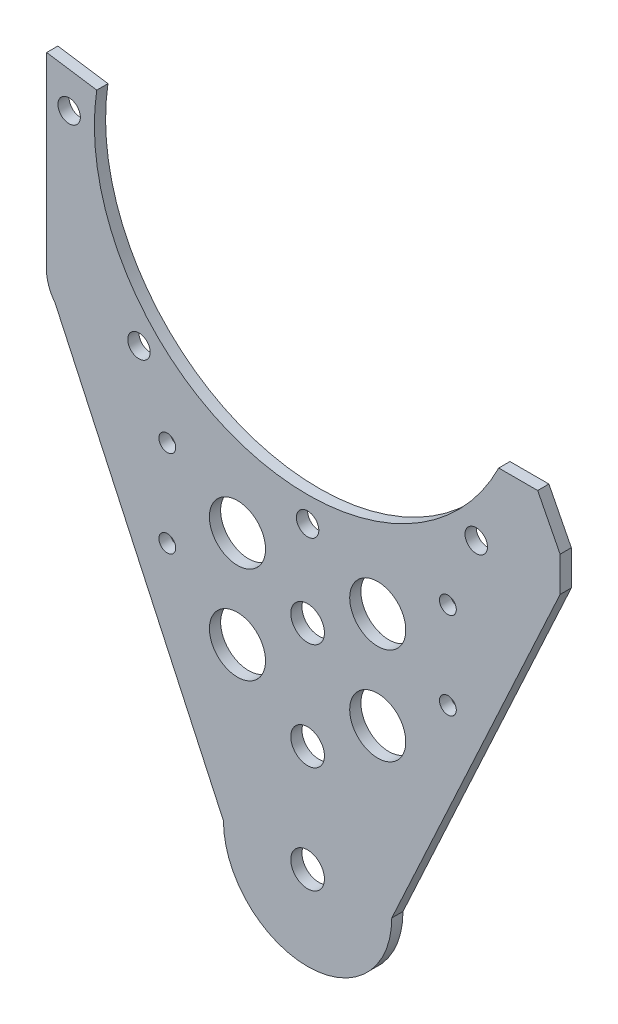
ISO-10303-21;
HEADER;
FILE_DESCRIPTION(('STEP AP214'),'2;1');
FILE_NAME('part.step','',(''),(''),'','','');
FILE_SCHEMA(('AUTOMOTIVE_DESIGN { 1 0 10303 214 1 1 1 1 }'));
ENDSEC;
DATA;
#1=APPLICATION_CONTEXT('core data for automotive mechanical design processes');
#2=APPLICATION_PROTOCOL_DEFINITION('international standard','automotive_design',2000,#1);
#3=PRODUCT_CONTEXT('',#1,'mechanical');
#4=PRODUCT('Part','Part','',(#3));
#5=PRODUCT_RELATED_PRODUCT_CATEGORY('part','',(#4));
#6=PRODUCT_DEFINITION_FORMATION('','',#4);
#7=PRODUCT_DEFINITION_CONTEXT('part definition',#1,'design');
#8=PRODUCT_DEFINITION('design','',#6,#7);
#9=PRODUCT_DEFINITION_SHAPE('','',#8);
#10=(LENGTH_UNIT() NAMED_UNIT(*) SI_UNIT(.MILLI.,.METRE.));
#11=(NAMED_UNIT(*) PLANE_ANGLE_UNIT() SI_UNIT($,.RADIAN.));
#12=(NAMED_UNIT(*) SI_UNIT($,.STERADIAN.) SOLID_ANGLE_UNIT());
#13=UNCERTAINTY_MEASURE_WITH_UNIT(LENGTH_MEASURE(1.E-05),#10,'distance_accuracy_value','');
#14=(GEOMETRIC_REPRESENTATION_CONTEXT(3) GLOBAL_UNCERTAINTY_ASSIGNED_CONTEXT((#13)) GLOBAL_UNIT_ASSIGNED_CONTEXT((#10,
#11,#12)) REPRESENTATION_CONTEXT('',''));
#15=CARTESIAN_POINT('',(0.,0.,0.));
#16=DIRECTION('',(0.,0.,1.));
#17=DIRECTION('',(1.,0.,0.));
#18=AXIS2_PLACEMENT_3D('',#15,#16,#17);
#19=CARTESIAN_POINT('',(0.,56.,2.));
#20=DIRECTION('',(0.,0.,1.));
#21=DIRECTION('',(1.,0.,0.));
#22=AXIS2_PLACEMENT_3D('',#19,#20,#21);
#23=PLANE('',#22);
#24=CARTESIAN_POINT('',(12.4999999999993,-11.4051083426373,2.));
#25=DIRECTION('',(0.,0.,1.));
#26=DIRECTION('',(-1.,0.,0.));
#27=AXIS2_PLACEMENT_3D('',#24,#25,#26);
#28=CIRCLE('',#27,5.00000000000163);
#29=CARTESIAN_POINT('',(7.49999999999769,-11.4051083426373,2.));
#30=VERTEX_POINT('',#29);
#31=EDGE_CURVE('E483',#30,#30,#28,.T.);
#32=ORIENTED_EDGE('',*,*,#31,.F.);
#33=EDGE_LOOP('',(#32));
#34=FACE_BOUND('',#33,.T.);
#35=CARTESIAN_POINT('',(-42.5,56.0000000000001,2.));
#36=DIRECTION('',(0.,0.,1.));
#37=DIRECTION('',(1.,0.,0.));
#38=AXIS2_PLACEMENT_3D('',#35,#36,#37);
#39=CIRCLE('',#38,2.);
#40=CARTESIAN_POINT('',(-40.5,56.0000000000001,2.));
#41=VERTEX_POINT('',#40);
#42=EDGE_CURVE('E495',#41,#41,#39,.T.);
#43=ORIENTED_EDGE('',*,*,#42,.F.);
#44=EDGE_LOOP('',(#43));
#45=FACE_BOUND('',#44,.T.);
#46=CARTESIAN_POINT('',(-12.4999999999987,-11.4051083426374,2.));
#47=DIRECTION('',(0.,0.,1.));
#48=DIRECTION('',(1.,0.,0.));
#49=AXIS2_PLACEMENT_3D('',#46,#47,#48);
#50=CIRCLE('',#49,5.00000000000164);
#51=CARTESIAN_POINT('',(-7.49999999999706,-11.4051083426374,2.));
#52=VERTEX_POINT('',#51);
#53=EDGE_CURVE('E507',#52,#52,#50,.T.);
#54=ORIENTED_EDGE('',*,*,#53,.F.);
#55=EDGE_LOOP('',(#54));
#56=FACE_BOUND('',#55,.T.);
#57=CARTESIAN_POINT('',(-30.0520382004283,25.9479617995718,2.));
#58=DIRECTION('',(0.,0.,1.));
#59=DIRECTION('',(1.,0.,0.));
#60=AXIS2_PLACEMENT_3D('',#57,#58,#59);
#61=CIRCLE('',#60,2.);
#62=CARTESIAN_POINT('',(-28.0520382004283,25.9479617995718,2.));
#63=VERTEX_POINT('',#62);
#64=EDGE_CURVE('E519',#63,#63,#61,.T.);
#65=ORIENTED_EDGE('',*,*,#64,.F.);
#66=EDGE_LOOP('',(#65));
#67=FACE_BOUND('',#66,.T.);
#68=CARTESIAN_POINT('',(24.9999999999965,13.509783314725,2.));
#69=DIRECTION('',(0.,0.,1.));
#70=DIRECTION('',(-1.,0.,0.));
#71=AXIS2_PLACEMENT_3D('',#68,#69,#70);
#72=CIRCLE('',#71,1.50000000000253);
#73=CARTESIAN_POINT('',(23.499999999994,13.509783314725,2.));
#74=VERTEX_POINT('',#73);
#75=EDGE_CURVE('E531',#74,#74,#72,.T.);
#76=ORIENTED_EDGE('',*,*,#75,.F.);
#77=EDGE_LOOP('',(#76));
#78=FACE_BOUND('',#77,.T.);
#79=CARTESIAN_POINT('',(1.65498506012817E-13,-1.82000000000001,2.));
#80=DIRECTION('',(0.,0.,1.));
#81=DIRECTION('',(1.,0.,0.));
#82=AXIS2_PLACEMENT_3D('',#79,#80,#81);
#83=CIRCLE('',#82,2.99999999999987);
#84=CARTESIAN_POINT('',(3.00000000000004,-1.82000000000001,2.));
#85=VERTEX_POINT('',#84);
#86=EDGE_CURVE('E543',#85,#85,#83,.T.);
#87=ORIENTED_EDGE('',*,*,#86,.F.);
#88=EDGE_LOOP('',(#87));
#89=FACE_BOUND('',#88,.T.);
#90=CARTESIAN_POINT('',(-1.23647570002783E-12,-20.82,2.));
#91=DIRECTION('',(0.,0.,1.));
#92=DIRECTION('',(1.,0.,0.));
#93=AXIS2_PLACEMENT_3D('',#90,#91,#92);
#94=CIRCLE('',#93,2.99999999999841);
#95=CARTESIAN_POINT('',(2.99999999999718,-20.82,2.));
#96=VERTEX_POINT('',#95);
#97=EDGE_CURVE('E555',#96,#96,#94,.T.);
#98=ORIENTED_EDGE('',*,*,#97,.F.);
#99=EDGE_LOOP('',(#98));
#100=FACE_BOUND('',#99,.T.);
#101=DIRECTION('',(0.,1.,0.));
#102=VECTOR('',#101,1.);
#103=CARTESIAN_POINT('',(44.9999999999948,25.1097833147259,2.));
#104=LINE('',#103,#102);
#105=CARTESIAN_POINT('',(44.9999999999948,25.1097833147259,2.));
#106=VERTEX_POINT('',#105);
#107=CARTESIAN_POINT('',(44.9999999999946,31.3170511820597,2.));
#108=VERTEX_POINT('',#107);
#109=EDGE_CURVE('E166',#106,#108,#104,.T.);
#110=ORIENTED_EDGE('',*,*,#109,.T.);
#111=DIRECTION('',(-0.454677876394381,0.890655954180679,0.));
#112=VECTOR('',#111,1.);
#113=CARTESIAN_POINT('',(44.9999999999946,31.3170511820597,2.));
#114=LINE('',#113,#112);
#115=CARTESIAN_POINT('',(40.9999999999945,39.1525408807769,2.));
#116=VERTEX_POINT('',#115);
#117=EDGE_CURVE('E99',#108,#116,#114,.T.);
#118=ORIENTED_EDGE('',*,*,#117,.T.);
#119=DIRECTION('',(-1.,0.,0.));
#120=VECTOR('',#119,1.);
#121=CARTESIAN_POINT('',(34.061167349727,39.1525408807769,2.));
#122=LINE('',#121,#120);
#123=CARTESIAN_POINT('',(34.061167349727,39.1525408807769,2.));
#124=VERTEX_POINT('',#123);
#125=EDGE_CURVE('E187',#116,#124,#122,.T.);
#126=ORIENTED_EDGE('',*,*,#125,.T.);
#127=CARTESIAN_POINT('',(0.,56.,2.));
#128=DIRECTION('',(0.,0.,-1.));
#129=DIRECTION('',(1.,0.,0.));
#130=AXIS2_PLACEMENT_3D('',#127,#128,#129);
#131=CIRCLE('',#130,38.);
#132=CARTESIAN_POINT('',(-37.5766125260326,61.6566943587582,2.));
#133=VERTEX_POINT('',#132);
#134=EDGE_CURVE('E206',#124,#133,#131,.T.);
#135=ORIENTED_EDGE('',*,*,#134,.T.);
#136=DIRECTION('',(-0.98885822436928,0.148860377862059,0.));
#137=VECTOR('',#136,1.);
#138=CARTESIAN_POINT('',(-46.4999999999946,63.,2.));
#139=LINE('',#138,#137);
#140=CARTESIAN_POINT('',(-46.4999999999946,63.,2.));
#141=VERTEX_POINT('',#140);
#142=EDGE_CURVE('E203',#133,#141,#139,.T.);
#143=ORIENTED_EDGE('',*,*,#142,.T.);
#144=DIRECTION('',(0.,-1.,0.));
#145=VECTOR('',#144,1.);
#146=CARTESIAN_POINT('',(-46.4999999999946,63.,2.));
#147=LINE('',#146,#145);
#148=CARTESIAN_POINT('',(-46.4999999999946,28.7734947561586,2.));
#149=VERTEX_POINT('',#148);
#150=EDGE_CURVE('E205',#141,#149,#147,.T.);
#151=ORIENTED_EDGE('',*,*,#150,.T.);
#152=CARTESIAN_POINT('',(-46.4999999999946,28.7734947561586,2.));
#153=CARTESIAN_POINT('',(-46.2742405415082,26.7251207672892,2.));
#154=CARTESIAN_POINT('',(-44.9999999999945,25.1097833147254,2.));
#155=B_SPLINE_CURVE_WITH_KNOTS('',2,(#152,#153,#154),.UNSPECIFIED.,.F.,.F.,(3,3),(0.,1.),.UNSPECIFIED.);
#156=CARTESIAN_POINT('',(-44.9999999999945,25.1097833147254,2.));
#157=VERTEX_POINT('',#156);
#158=EDGE_CURVE('E124',#149,#157,#155,.T.);
#159=ORIENTED_EDGE('',*,*,#158,.T.);
#160=DIRECTION('',(0.419431668165056,-0.907786910976512,0.));
#161=VECTOR('',#160,1.);
#162=CARTESIAN_POINT('',(-44.9999999999945,25.1097833147254,2.));
#163=LINE('',#162,#161);
#164=CARTESIAN_POINT('',(-14.9999999999996,-39.82,2.));
#165=VERTEX_POINT('',#164);
#166=EDGE_CURVE('E118',#157,#165,#163,.T.);
#167=ORIENTED_EDGE('',*,*,#166,.T.);
#168=CARTESIAN_POINT('',(3.50073083856771E-13,-39.82,2.));
#169=DIRECTION('',(0.,0.,1.));
#170=DIRECTION('',(1.,0.,0.));
#171=AXIS2_PLACEMENT_3D('',#168,#169,#170);
#172=CIRCLE('',#171,15.);
#173=CARTESIAN_POINT('',(15.0000000000006,-39.82,2.));
#174=VERTEX_POINT('',#173);
#175=EDGE_CURVE('E122',#165,#174,#172,.T.);
#176=ORIENTED_EDGE('',*,*,#175,.T.);
#177=DIRECTION('',(0.419431668165044,0.907786910976518,0.));
#178=VECTOR('',#177,1.);
#179=CARTESIAN_POINT('',(44.9999999999948,25.1097833147259,2.));
#180=LINE('',#179,#178);
#181=EDGE_CURVE('E50',#174,#106,#180,.T.);
#182=ORIENTED_EDGE('',*,*,#181,.T.);
#183=EDGE_LOOP('',(#110,#118,#126,#135,#143,#151,#159,#167,#176,#182));
#184=FACE_BOUND('',#183,.T.);
#185=CARTESIAN_POINT('',(-24.9999999999961,-1.99021668527465,2.));
#186=DIRECTION('',(0.,0.,1.));
#187=DIRECTION('',(1.,0.,0.));
#188=AXIS2_PLACEMENT_3D('',#185,#186,#187);
#189=CIRCLE('',#188,1.50000000000158);
#190=CARTESIAN_POINT('',(-23.4999999999945,-1.99021668527465,2.));
#191=VERTEX_POINT('',#190);
#192=EDGE_CURVE('E146',#191,#191,#189,.T.);
#193=ORIENTED_EDGE('',*,*,#192,.F.);
#194=EDGE_LOOP('',(#193));
#195=FACE_BOUND('',#194,.T.);
#196=CARTESIAN_POINT('',(3.50073083856771E-13,-39.82,2.));
#197=DIRECTION('',(0.,0.,1.));
#198=DIRECTION('',(1.,0.,0.));
#199=AXIS2_PLACEMENT_3D('',#196,#197,#198);
#200=CIRCLE('',#199,2.9999999999998);
#201=CARTESIAN_POINT('',(3.00000000000015,-39.82,2.));
#202=VERTEX_POINT('',#201);
#203=EDGE_CURVE('E549',#202,#202,#200,.T.);
#204=ORIENTED_EDGE('',*,*,#203,.F.);
#205=EDGE_LOOP('',(#204));
#206=FACE_BOUND('',#205,.T.);
#207=CARTESIAN_POINT('',(-24.9999999999966,13.5097833147244,2.));
#208=DIRECTION('',(0.,0.,1.));
#209=DIRECTION('',(1.,0.,0.));
#210=AXIS2_PLACEMENT_3D('',#207,#208,#209);
#211=CIRCLE('',#210,1.50000000000305);
#212=CARTESIAN_POINT('',(-23.4999999999935,13.5097833147244,2.));
#213=VERTEX_POINT('',#212);
#214=EDGE_CURVE('E537',#213,#213,#211,.T.);
#215=ORIENTED_EDGE('',*,*,#214,.F.);
#216=EDGE_LOOP('',(#215));
#217=FACE_BOUND('',#216,.T.);
#218=CARTESIAN_POINT('',(0.,13.5,2.));
#219=DIRECTION('',(0.,0.,1.));
#220=DIRECTION('',(1.,0.,0.));
#221=AXIS2_PLACEMENT_3D('',#218,#219,#220);
#222=CIRCLE('',#221,2.);
#223=CARTESIAN_POINT('',(1.99999999999992,13.5,2.));
#224=VERTEX_POINT('',#223);
#225=EDGE_CURVE('E525',#224,#224,#222,.T.);
#226=ORIENTED_EDGE('',*,*,#225,.F.);
#227=EDGE_LOOP('',(#226));
#228=FACE_BOUND('',#227,.T.);
#229=CARTESIAN_POINT('',(24.9999999999967,-1.99021668527441,2.));
#230=DIRECTION('',(0.,0.,1.));
#231=DIRECTION('',(-1.,0.,0.));
#232=AXIS2_PLACEMENT_3D('',#229,#230,#231);
#233=CIRCLE('',#232,1.50000000000165);
#234=CARTESIAN_POINT('',(23.499999999995,-1.99021668527441,2.));
#235=VERTEX_POINT('',#234);
#236=EDGE_CURVE('E513',#235,#235,#233,.T.);
#237=ORIENTED_EDGE('',*,*,#236,.F.);
#238=EDGE_LOOP('',(#237));
#239=FACE_BOUND('',#238,.T.);
#240=CARTESIAN_POINT('',(-12.4999999999981,5.84489165736238,2.));
#241=DIRECTION('',(0.,0.,1.));
#242=DIRECTION('',(1.,0.,0.));
#243=AXIS2_PLACEMENT_3D('',#240,#241,#242);
#244=CIRCLE('',#243,5.00000000000132);
#245=CARTESIAN_POINT('',(-7.49999999999678,5.84489165736238,2.));
#246=VERTEX_POINT('',#245);
#247=EDGE_CURVE('E501',#246,#246,#244,.T.);
#248=ORIENTED_EDGE('',*,*,#247,.F.);
#249=EDGE_LOOP('',(#248));
#250=FACE_BOUND('',#249,.T.);
#251=CARTESIAN_POINT('',(12.4999999999985,5.84489165736232,2.));
#252=DIRECTION('',(0.,0.,1.));
#253=DIRECTION('',(-1.,0.,0.));
#254=AXIS2_PLACEMENT_3D('',#251,#252,#253);
#255=CIRCLE('',#254,5.00000000000126);
#256=CARTESIAN_POINT('',(7.4999999999972,5.84489165736232,2.));
#257=VERTEX_POINT('',#256);
#258=EDGE_CURVE('E489',#257,#257,#255,.T.);
#259=ORIENTED_EDGE('',*,*,#258,.F.);
#260=EDGE_LOOP('',(#259));
#261=FACE_BOUND('',#260,.T.);
#262=CARTESIAN_POINT('',(30.0520382004282,25.9479617995717,2.));
#263=DIRECTION('',(0.,0.,1.));
#264=DIRECTION('',(1.,0.,0.));
#265=AXIS2_PLACEMENT_3D('',#262,#263,#264);
#266=CIRCLE('',#265,2.);
#267=CARTESIAN_POINT('',(32.0520382004282,25.9479617995717,2.));
#268=VERTEX_POINT('',#267);
#269=EDGE_CURVE('E474',#268,#268,#266,.T.);
#270=ORIENTED_EDGE('',*,*,#269,.F.);
#271=EDGE_LOOP('',(#270));
#272=FACE_BOUND('',#271,.T.);
#273=ADVANCED_FACE('F33',(#34,#45,#56,#67,#78,#89,#100,#184,#195,#206,#217,#228,#239,#250,#261,
#272),#23,.T.);
#274=CARTESIAN_POINT('',(0.,56.,0.));
#275=DIRECTION('',(0.,0.,1.));
#276=DIRECTION('',(1.,0.,0.));
#277=AXIS2_PLACEMENT_3D('',#274,#275,#276);
#278=PLANE('',#277);
#279=DIRECTION('',(0.,1.,0.));
#280=VECTOR('',#279,1.);
#281=CARTESIAN_POINT('',(44.9999999999948,25.1097833147259,0.));
#282=LINE('',#281,#280);
#283=CARTESIAN_POINT('',(44.9999999999948,25.1097833147259,0.));
#284=VERTEX_POINT('',#283);
#285=CARTESIAN_POINT('',(44.9999999999946,31.3170511820597,0.));
#286=VERTEX_POINT('',#285);
#287=EDGE_CURVE('E142',#284,#286,#282,.T.);
#288=ORIENTED_EDGE('',*,*,#287,.F.);
#289=DIRECTION('',(0.419431668165044,0.907786910976518,0.));
#290=VECTOR('',#289,1.);
#291=CARTESIAN_POINT('',(44.9999999999948,25.1097833147259,0.));
#292=LINE('',#291,#290);
#293=CARTESIAN_POINT('',(15.0000000000006,-39.82,0.));
#294=VERTEX_POINT('',#293);
#295=EDGE_CURVE('E91',#294,#284,#292,.T.);
#296=ORIENTED_EDGE('',*,*,#295,.F.);
#297=CARTESIAN_POINT('',(3.50073083856771E-13,-39.82,0.));
#298=DIRECTION('',(0.,0.,1.));
#299=DIRECTION('',(1.,0.,0.));
#300=AXIS2_PLACEMENT_3D('',#297,#298,#299);
#301=CIRCLE('',#300,15.);
#302=CARTESIAN_POINT('',(-14.9999999999996,-39.82,0.));
#303=VERTEX_POINT('',#302);
#304=EDGE_CURVE('E85',#303,#294,#301,.T.);
#305=ORIENTED_EDGE('',*,*,#304,.F.);
#306=DIRECTION('',(0.419431668165056,-0.907786910976512,0.));
#307=VECTOR('',#306,1.);
#308=CARTESIAN_POINT('',(-44.9999999999945,25.1097833147254,0.));
#309=LINE('',#308,#307);
#310=CARTESIAN_POINT('',(-44.9999999999945,25.1097833147254,0.));
#311=VERTEX_POINT('',#310);
#312=EDGE_CURVE('E132',#311,#303,#309,.T.);
#313=ORIENTED_EDGE('',*,*,#312,.F.);
#314=CARTESIAN_POINT('',(-46.4999999999946,28.7734947561586,0.));
#315=CARTESIAN_POINT('',(-46.2742405415082,26.7251207672892,0.));
#316=CARTESIAN_POINT('',(-44.9999999999945,25.1097833147254,0.));
#317=B_SPLINE_CURVE_WITH_KNOTS('',2,(#314,#315,#316),.UNSPECIFIED.,.F.,.F.,(3,3),(0.,1.),.UNSPECIFIED.);
#318=CARTESIAN_POINT('',(-46.4999999999946,28.7734947561586,0.));
#319=VERTEX_POINT('',#318);
#320=EDGE_CURVE('E156',#319,#311,#317,.T.);
#321=ORIENTED_EDGE('',*,*,#320,.F.);
#322=DIRECTION('',(0.,-1.,0.));
#323=VECTOR('',#322,1.);
#324=CARTESIAN_POINT('',(-46.4999999999946,63.,0.));
#325=LINE('',#324,#323);
#326=CARTESIAN_POINT('',(-46.4999999999946,63.,0.));
#327=VERTEX_POINT('',#326);
#328=EDGE_CURVE('E154',#327,#319,#325,.T.);
#329=ORIENTED_EDGE('',*,*,#328,.F.);
#330=DIRECTION('',(-0.98885822436928,0.148860377862059,0.));
#331=VECTOR('',#330,1.);
#332=CARTESIAN_POINT('',(-46.4999999999946,63.,0.));
#333=LINE('',#332,#331);
#334=CARTESIAN_POINT('',(-37.5766125260326,61.6566943587582,0.));
#335=VERTEX_POINT('',#334);
#336=EDGE_CURVE('E152',#335,#327,#333,.T.);
#337=ORIENTED_EDGE('',*,*,#336,.F.);
#338=CARTESIAN_POINT('',(0.,56.,0.));
#339=DIRECTION('',(0.,0.,-1.));
#340=DIRECTION('',(1.,0.,0.));
#341=AXIS2_PLACEMENT_3D('',#338,#339,#340);
#342=CIRCLE('',#341,38.);
#343=CARTESIAN_POINT('',(34.061167349727,39.1525408807769,0.));
#344=VERTEX_POINT('',#343);
#345=EDGE_CURVE('E150',#344,#335,#342,.T.);
#346=ORIENTED_EDGE('',*,*,#345,.F.);
#347=DIRECTION('',(-1.,0.,0.));
#348=VECTOR('',#347,1.);
#349=CARTESIAN_POINT('',(34.061167349727,39.1525408807769,0.));
#350=LINE('',#349,#348);
#351=CARTESIAN_POINT('',(40.9999999999945,39.1525408807769,0.));
#352=VERTEX_POINT('',#351);
#353=EDGE_CURVE('E148',#352,#344,#350,.T.);
#354=ORIENTED_EDGE('',*,*,#353,.F.);
#355=DIRECTION('',(-0.454677876394381,0.890655954180679,0.));
#356=VECTOR('',#355,1.);
#357=CARTESIAN_POINT('',(44.9999999999946,31.3170511820597,0.));
#358=LINE('',#357,#356);
#359=EDGE_CURVE('E145',#286,#352,#358,.T.);
#360=ORIENTED_EDGE('',*,*,#359,.F.);
#361=EDGE_LOOP('',(#288,#296,#305,#313,#321,#329,#337,#346,#354,#360));
#362=FACE_BOUND('',#361,.T.);
#363=CARTESIAN_POINT('',(-24.9999999999961,-1.99021668527465,0.));
#364=DIRECTION('',(0.,0.,1.));
#365=DIRECTION('',(1.,0.,0.));
#366=AXIS2_PLACEMENT_3D('',#363,#364,#365);
#367=CIRCLE('',#366,1.50000000000158);
#368=CARTESIAN_POINT('',(-23.4999999999945,-1.99021668527465,0.));
#369=VERTEX_POINT('',#368);
#370=EDGE_CURVE('E558',#369,#369,#367,.T.);
#371=ORIENTED_EDGE('',*,*,#370,.T.);
#372=EDGE_LOOP('',(#371));
#373=FACE_BOUND('',#372,.T.);
#374=CARTESIAN_POINT('',(-1.23647570002783E-12,-20.82,0.));
#375=DIRECTION('',(0.,0.,1.));
#376=DIRECTION('',(1.,0.,0.));
#377=AXIS2_PLACEMENT_3D('',#374,#375,#376);
#378=CIRCLE('',#377,2.99999999999841);
#379=CARTESIAN_POINT('',(2.99999999999718,-20.82,0.));
#380=VERTEX_POINT('',#379);
#381=EDGE_CURVE('E552',#380,#380,#378,.T.);
#382=ORIENTED_EDGE('',*,*,#381,.T.);
#383=EDGE_LOOP('',(#382));
#384=FACE_BOUND('',#383,.T.);
#385=CARTESIAN_POINT('',(3.50073083856771E-13,-39.82,0.));
#386=DIRECTION('',(0.,0.,1.));
#387=DIRECTION('',(1.,0.,0.));
#388=AXIS2_PLACEMENT_3D('',#385,#386,#387);
#389=CIRCLE('',#388,2.9999999999998);
#390=CARTESIAN_POINT('',(3.00000000000015,-39.82,0.));
#391=VERTEX_POINT('',#390);
#392=EDGE_CURVE('E546',#391,#391,#389,.T.);
#393=ORIENTED_EDGE('',*,*,#392,.T.);
#394=EDGE_LOOP('',(#393));
#395=FACE_BOUND('',#394,.T.);
#396=CARTESIAN_POINT('',(1.65498506012817E-13,-1.82000000000001,0.));
#397=DIRECTION('',(0.,0.,1.));
#398=DIRECTION('',(1.,0.,0.));
#399=AXIS2_PLACEMENT_3D('',#396,#397,#398);
#400=CIRCLE('',#399,2.99999999999987);
#401=CARTESIAN_POINT('',(3.00000000000004,-1.82000000000001,0.));
#402=VERTEX_POINT('',#401);
#403=EDGE_CURVE('E540',#402,#402,#400,.T.);
#404=ORIENTED_EDGE('',*,*,#403,.T.);
#405=EDGE_LOOP('',(#404));
#406=FACE_BOUND('',#405,.T.);
#407=CARTESIAN_POINT('',(-24.9999999999966,13.5097833147244,0.));
#408=DIRECTION('',(0.,0.,1.));
#409=DIRECTION('',(1.,0.,0.));
#410=AXIS2_PLACEMENT_3D('',#407,#408,#409);
#411=CIRCLE('',#410,1.50000000000305);
#412=CARTESIAN_POINT('',(-23.4999999999935,13.5097833147244,0.));
#413=VERTEX_POINT('',#412);
#414=EDGE_CURVE('E534',#413,#413,#411,.T.);
#415=ORIENTED_EDGE('',*,*,#414,.T.);
#416=EDGE_LOOP('',(#415));
#417=FACE_BOUND('',#416,.T.);
#418=CARTESIAN_POINT('',(24.9999999999965,13.509783314725,0.));
#419=DIRECTION('',(0.,0.,1.));
#420=DIRECTION('',(-1.,0.,0.));
#421=AXIS2_PLACEMENT_3D('',#418,#419,#420);
#422=CIRCLE('',#421,1.50000000000253);
#423=CARTESIAN_POINT('',(23.499999999994,13.509783314725,0.));
#424=VERTEX_POINT('',#423);
#425=EDGE_CURVE('E528',#424,#424,#422,.T.);
#426=ORIENTED_EDGE('',*,*,#425,.T.);
#427=EDGE_LOOP('',(#426));
#428=FACE_BOUND('',#427,.T.);
#429=CARTESIAN_POINT('',(0.,13.5,0.));
#430=DIRECTION('',(0.,0.,1.));
#431=DIRECTION('',(1.,0.,0.));
#432=AXIS2_PLACEMENT_3D('',#429,#430,#431);
#433=CIRCLE('',#432,2.);
#434=CARTESIAN_POINT('',(1.99999999999992,13.5,0.));
#435=VERTEX_POINT('',#434);
#436=EDGE_CURVE('E522',#435,#435,#433,.T.);
#437=ORIENTED_EDGE('',*,*,#436,.T.);
#438=EDGE_LOOP('',(#437));
#439=FACE_BOUND('',#438,.T.);
#440=CARTESIAN_POINT('',(-30.0520382004283,25.9479617995718,0.));
#441=DIRECTION('',(0.,0.,1.));
#442=DIRECTION('',(1.,0.,0.));
#443=AXIS2_PLACEMENT_3D('',#440,#441,#442);
#444=CIRCLE('',#443,2.);
#445=CARTESIAN_POINT('',(-28.0520382004283,25.9479617995718,0.));
#446=VERTEX_POINT('',#445);
#447=EDGE_CURVE('E516',#446,#446,#444,.T.);
#448=ORIENTED_EDGE('',*,*,#447,.T.);
#449=EDGE_LOOP('',(#448));
#450=FACE_BOUND('',#449,.T.);
#451=CARTESIAN_POINT('',(24.9999999999967,-1.99021668527441,0.));
#452=DIRECTION('',(0.,0.,1.));
#453=DIRECTION('',(-1.,0.,0.));
#454=AXIS2_PLACEMENT_3D('',#451,#452,#453);
#455=CIRCLE('',#454,1.50000000000165);
#456=CARTESIAN_POINT('',(23.499999999995,-1.99021668527441,0.));
#457=VERTEX_POINT('',#456);
#458=EDGE_CURVE('E510',#457,#457,#455,.T.);
#459=ORIENTED_EDGE('',*,*,#458,.T.);
#460=EDGE_LOOP('',(#459));
#461=FACE_BOUND('',#460,.T.);
#462=CARTESIAN_POINT('',(-12.4999999999987,-11.4051083426374,0.));
#463=DIRECTION('',(0.,0.,1.));
#464=DIRECTION('',(1.,0.,0.));
#465=AXIS2_PLACEMENT_3D('',#462,#463,#464);
#466=CIRCLE('',#465,5.00000000000164);
#467=CARTESIAN_POINT('',(-7.49999999999706,-11.4051083426374,0.));
#468=VERTEX_POINT('',#467);
#469=EDGE_CURVE('E504',#468,#468,#466,.T.);
#470=ORIENTED_EDGE('',*,*,#469,.T.);
#471=EDGE_LOOP('',(#470));
#472=FACE_BOUND('',#471,.T.);
#473=CARTESIAN_POINT('',(-12.4999999999981,5.84489165736238,0.));
#474=DIRECTION('',(0.,0.,1.));
#475=DIRECTION('',(1.,0.,0.));
#476=AXIS2_PLACEMENT_3D('',#473,#474,#475);
#477=CIRCLE('',#476,5.00000000000132);
#478=CARTESIAN_POINT('',(-7.49999999999678,5.84489165736238,0.));
#479=VERTEX_POINT('',#478);
#480=EDGE_CURVE('E498',#479,#479,#477,.T.);
#481=ORIENTED_EDGE('',*,*,#480,.T.);
#482=EDGE_LOOP('',(#481));
#483=FACE_BOUND('',#482,.T.);
#484=CARTESIAN_POINT('',(-42.5,56.0000000000001,0.));
#485=DIRECTION('',(0.,0.,1.));
#486=DIRECTION('',(1.,0.,0.));
#487=AXIS2_PLACEMENT_3D('',#484,#485,#486);
#488=CIRCLE('',#487,2.);
#489=CARTESIAN_POINT('',(-40.5,56.0000000000001,0.));
#490=VERTEX_POINT('',#489);
#491=EDGE_CURVE('E492',#490,#490,#488,.T.);
#492=ORIENTED_EDGE('',*,*,#491,.T.);
#493=EDGE_LOOP('',(#492));
#494=FACE_BOUND('',#493,.T.);
#495=CARTESIAN_POINT('',(12.4999999999985,5.84489165736232,0.));
#496=DIRECTION('',(0.,0.,1.));
#497=DIRECTION('',(-1.,0.,0.));
#498=AXIS2_PLACEMENT_3D('',#495,#496,#497);
#499=CIRCLE('',#498,5.00000000000126);
#500=CARTESIAN_POINT('',(7.4999999999972,5.84489165736232,0.));
#501=VERTEX_POINT('',#500);
#502=EDGE_CURVE('E486',#501,#501,#499,.T.);
#503=ORIENTED_EDGE('',*,*,#502,.T.);
#504=EDGE_LOOP('',(#503));
#505=FACE_BOUND('',#504,.T.);
#506=CARTESIAN_POINT('',(12.4999999999993,-11.4051083426373,0.));
#507=DIRECTION('',(0.,0.,1.));
#508=DIRECTION('',(-1.,0.,0.));
#509=AXIS2_PLACEMENT_3D('',#506,#507,#508);
#510=CIRCLE('',#509,5.00000000000163);
#511=CARTESIAN_POINT('',(7.49999999999769,-11.4051083426373,0.));
#512=VERTEX_POINT('',#511);
#513=EDGE_CURVE('E480',#512,#512,#510,.T.);
#514=ORIENTED_EDGE('',*,*,#513,.T.);
#515=EDGE_LOOP('',(#514));
#516=FACE_BOUND('',#515,.T.);
#517=CARTESIAN_POINT('',(30.0520382004282,25.9479617995717,0.));
#518=DIRECTION('',(0.,0.,1.));
#519=DIRECTION('',(1.,0.,0.));
#520=AXIS2_PLACEMENT_3D('',#517,#518,#519);
#521=CIRCLE('',#520,2.);
#522=CARTESIAN_POINT('',(32.0520382004282,25.9479617995717,0.));
#523=VERTEX_POINT('',#522);
#524=EDGE_CURVE('E477',#523,#523,#521,.T.);
#525=ORIENTED_EDGE('',*,*,#524,.T.);
#526=EDGE_LOOP('',(#525));
#527=FACE_BOUND('',#526,.T.);
#528=ADVANCED_FACE('F191',(#362,#373,#384,#395,#406,#417,#428,#439,#450,#461,#472,#483,#494,
#505,#516,#527),#278,.F.);
#529=CARTESIAN_POINT('',(44.9999999999948,25.1097833147259,2.));
#530=DIRECTION('',(-1.,0.,0.));
#531=DIRECTION('',(0.,-1.,0.));
#532=AXIS2_PLACEMENT_3D('',#529,#530,#531);
#533=PLANE('',#532);
#534=ORIENTED_EDGE('',*,*,#287,.T.);
#535=DIRECTION('',(0.,0.,-1.));
#536=VECTOR('',#535,1.);
#537=CARTESIAN_POINT('',(44.9999999999946,31.3170511820597,2.));
#538=LINE('',#537,#536);
#539=EDGE_CURVE('E11',#108,#286,#538,.T.);
#540=ORIENTED_EDGE('',*,*,#539,.F.);
#541=ORIENTED_EDGE('',*,*,#109,.F.);
#542=DIRECTION('',(0.,0.,-1.));
#543=VECTOR('',#542,1.);
#544=CARTESIAN_POINT('',(44.9999999999948,25.1097833147259,2.));
#545=LINE('',#544,#543);
#546=EDGE_CURVE('E138',#106,#284,#545,.T.);
#547=ORIENTED_EDGE('',*,*,#546,.T.);
#548=EDGE_LOOP('',(#534,#540,#541,#547));
#549=FACE_BOUND('',#548,.T.);
#550=ADVANCED_FACE('F35',(#549),#533,.F.);
#551=CARTESIAN_POINT('',(44.9999999999946,31.3170511820597,2.));
#552=DIRECTION('',(-0.890655954180679,-0.454677876394381,0.));
#553=DIRECTION('',(0.454677876394381,-0.890655954180679,0.));
#554=AXIS2_PLACEMENT_3D('',#551,#552,#553);
#555=PLANE('',#554);
#556=ORIENTED_EDGE('',*,*,#359,.T.);
#557=DIRECTION('',(0.,0.,-1.));
#558=VECTOR('',#557,1.);
#559=CARTESIAN_POINT('',(40.9999999999945,39.1525408807769,2.));
#560=LINE('',#559,#558);
#561=EDGE_CURVE('E42',#116,#352,#560,.T.);
#562=ORIENTED_EDGE('',*,*,#561,.F.);
#563=ORIENTED_EDGE('',*,*,#117,.F.);
#564=ORIENTED_EDGE('',*,*,#539,.T.);
#565=EDGE_LOOP('',(#556,#562,#563,#564));
#566=FACE_BOUND('',#565,.T.);
#567=ADVANCED_FACE('F233',(#566),#555,.F.);
#568=CARTESIAN_POINT('',(34.061167349727,39.1525408807769,2.));
#569=DIRECTION('',(0.,-1.,0.));
#570=DIRECTION('',(0.,0.,-1.));
#571=AXIS2_PLACEMENT_3D('',#568,#569,#570);
#572=PLANE('',#571);
#573=ORIENTED_EDGE('',*,*,#353,.T.);
#574=DIRECTION('',(0.,0.,-1.));
#575=VECTOR('',#574,1.);
#576=CARTESIAN_POINT('',(34.061167349727,39.1525408807769,2.));
#577=LINE('',#576,#575);
#578=EDGE_CURVE('E179',#124,#344,#577,.T.);
#579=ORIENTED_EDGE('',*,*,#578,.F.);
#580=ORIENTED_EDGE('',*,*,#125,.F.);
#581=ORIENTED_EDGE('',*,*,#561,.T.);
#582=EDGE_LOOP('',(#573,#579,#580,#581));
#583=FACE_BOUND('',#582,.T.);
#584=ADVANCED_FACE('F185',(#583),#572,.F.);
#585=CARTESIAN_POINT('',(0.,56.,2.));
#586=DIRECTION('',(0.,0.,-1.));
#587=DIRECTION('',(-1.,0.,0.));
#588=AXIS2_PLACEMENT_3D('',#585,#586,#587);
#589=CYLINDRICAL_SURFACE('',#588,38.);
#590=ORIENTED_EDGE('',*,*,#345,.T.);
#591=DIRECTION('',(0.,0.,-1.));
#592=VECTOR('',#591,1.);
#593=CARTESIAN_POINT('',(-37.5766125260326,61.6566943587582,2.));
#594=LINE('',#593,#592);
#595=EDGE_CURVE('E176',#133,#335,#594,.T.);
#596=ORIENTED_EDGE('',*,*,#595,.F.);
#597=ORIENTED_EDGE('',*,*,#134,.F.);
#598=ORIENTED_EDGE('',*,*,#578,.T.);
#599=EDGE_LOOP('',(#590,#596,#597,#598));
#600=FACE_BOUND('',#599,.T.);
#601=ADVANCED_FACE('F197',(#600),#589,.F.);
#602=CARTESIAN_POINT('',(-46.4999999999946,63.,2.));
#603=DIRECTION('',(-0.148860377862059,-0.98885822436928,0.));
#604=DIRECTION('',(0.98885822436928,-0.148860377862059,0.));
#605=AXIS2_PLACEMENT_3D('',#602,#603,#604);
#606=PLANE('',#605);
#607=ORIENTED_EDGE('',*,*,#336,.T.);
#608=DIRECTION('',(0.,0.,-1.));
#609=VECTOR('',#608,1.);
#610=CARTESIAN_POINT('',(-46.4999999999946,63.,2.));
#611=LINE('',#610,#609);
#612=EDGE_CURVE('E173',#141,#327,#611,.T.);
#613=ORIENTED_EDGE('',*,*,#612,.F.);
#614=ORIENTED_EDGE('',*,*,#142,.F.);
#615=ORIENTED_EDGE('',*,*,#595,.T.);
#616=EDGE_LOOP('',(#607,#613,#614,#615));
#617=FACE_BOUND('',#616,.T.);
#618=ADVANCED_FACE('F201',(#617),#606,.F.);
#619=CARTESIAN_POINT('',(-46.4999999999946,63.,2.));
#620=DIRECTION('',(1.,0.,0.));
#621=DIRECTION('',(0.,0.,-1.));
#622=AXIS2_PLACEMENT_3D('',#619,#620,#621);
#623=PLANE('',#622);
#624=ORIENTED_EDGE('',*,*,#328,.T.);
#625=DIRECTION('',(0.,0.,-1.));
#626=VECTOR('',#625,1.);
#627=CARTESIAN_POINT('',(-46.4999999999946,28.7734947561586,2.));
#628=LINE('',#627,#626);
#629=EDGE_CURVE('E170',#149,#319,#628,.T.);
#630=ORIENTED_EDGE('',*,*,#629,.F.);
#631=ORIENTED_EDGE('',*,*,#150,.F.);
#632=ORIENTED_EDGE('',*,*,#612,.T.);
#633=EDGE_LOOP('',(#624,#630,#631,#632));
#634=FACE_BOUND('',#633,.T.);
#635=ADVANCED_FACE('F222',(#634),#623,.F.);
#636=DIRECTION('',(0.,0.,-1.));
#637=VECTOR('',#636,1.);
#638=SURFACE_OF_LINEAR_EXTRUSION('',#155,#637);
#639=ORIENTED_EDGE('',*,*,#320,.T.);
#640=DIRECTION('',(0.,0.,-1.));
#641=VECTOR('',#640,1.);
#642=CARTESIAN_POINT('',(-44.9999999999945,25.1097833147254,2.));
#643=LINE('',#642,#641);
#644=EDGE_CURVE('E133',#157,#311,#643,.T.);
#645=ORIENTED_EDGE('',*,*,#644,.F.);
#646=ORIENTED_EDGE('',*,*,#158,.F.);
#647=ORIENTED_EDGE('',*,*,#629,.T.);
#648=EDGE_LOOP('',(#639,#645,#646,#647));
#649=FACE_BOUND('',#648,.T.);
#650=ADVANCED_FACE('F218',(#649),#638,.F.);
#651=CARTESIAN_POINT('',(-44.9999999999945,25.1097833147254,2.));
#652=DIRECTION('',(0.907786910976512,0.419431668165056,0.));
#653=DIRECTION('',(-0.419431668165056,0.907786910976512,0.));
#654=AXIS2_PLACEMENT_3D('',#651,#652,#653);
#655=PLANE('',#654);
#656=ORIENTED_EDGE('',*,*,#312,.T.);
#657=DIRECTION('',(0.,0.,-1.));
#658=VECTOR('',#657,1.);
#659=CARTESIAN_POINT('',(-14.9999999999996,-39.82,2.));
#660=LINE('',#659,#658);
#661=EDGE_CURVE('E129',#165,#303,#660,.T.);
#662=ORIENTED_EDGE('',*,*,#661,.F.);
#663=ORIENTED_EDGE('',*,*,#166,.F.);
#664=ORIENTED_EDGE('',*,*,#644,.T.);
#665=EDGE_LOOP('',(#656,#662,#663,#664));
#666=FACE_BOUND('',#665,.T.);
#667=ADVANCED_FACE('F130',(#666),#655,.F.);
#668=CARTESIAN_POINT('',(3.50073083856771E-13,-39.82,2.));
#669=DIRECTION('',(0.,0.,-1.));
#670=DIRECTION('',(-1.,0.,0.));
#671=AXIS2_PLACEMENT_3D('',#668,#669,#670);
#672=CYLINDRICAL_SURFACE('',#671,15.);
#673=ORIENTED_EDGE('',*,*,#304,.T.);
#674=DIRECTION('',(0.,0.,-1.));
#675=VECTOR('',#674,1.);
#676=CARTESIAN_POINT('',(15.0000000000006,-39.82,2.));
#677=LINE('',#676,#675);
#678=EDGE_CURVE('E134',#174,#294,#677,.T.);
#679=ORIENTED_EDGE('',*,*,#678,.F.);
#680=ORIENTED_EDGE('',*,*,#175,.F.);
#681=ORIENTED_EDGE('',*,*,#661,.T.);
#682=EDGE_LOOP('',(#673,#679,#680,#681));
#683=FACE_BOUND('',#682,.T.);
#684=ADVANCED_FACE('F136',(#683),#672,.T.);
#685=CARTESIAN_POINT('',(44.9999999999948,25.1097833147259,2.));
#686=DIRECTION('',(-0.907786910976518,0.419431668165044,0.));
#687=DIRECTION('',(-0.419431668165044,-0.907786910976518,0.));
#688=AXIS2_PLACEMENT_3D('',#685,#686,#687);
#689=PLANE('',#688);
#690=ORIENTED_EDGE('',*,*,#295,.T.);
#691=ORIENTED_EDGE('',*,*,#546,.F.);
#692=ORIENTED_EDGE('',*,*,#181,.F.);
#693=ORIENTED_EDGE('',*,*,#678,.T.);
#694=EDGE_LOOP('',(#690,#691,#692,#693));
#695=FACE_BOUND('',#694,.T.);
#696=ADVANCED_FACE('F252',(#695),#689,.F.);
#697=CARTESIAN_POINT('',(-24.9999999999961,-1.99021668527465,2.));
#698=DIRECTION('',(0.,0.,-1.));
#699=DIRECTION('',(-1.,0.,0.));
#700=AXIS2_PLACEMENT_3D('',#697,#698,#699);
#701=CYLINDRICAL_SURFACE('',#700,1.50000000000158);
#702=ORIENTED_EDGE('',*,*,#192,.T.);
#703=EDGE_LOOP('',(#702));
#704=FACE_BOUND('',#703,.T.);
#705=ORIENTED_EDGE('',*,*,#370,.F.);
#706=EDGE_LOOP('',(#705));
#707=FACE_BOUND('',#706,.T.);
#708=ADVANCED_FACE('F249',(#704,#707),#701,.F.);
#709=CARTESIAN_POINT('',(-1.23647570002783E-12,-20.82,2.));
#710=DIRECTION('',(0.,0.,-1.));
#711=DIRECTION('',(-1.,0.,0.));
#712=AXIS2_PLACEMENT_3D('',#709,#710,#711);
#713=CYLINDRICAL_SURFACE('',#712,2.99999999999841);
#714=ORIENTED_EDGE('',*,*,#97,.T.);
#715=EDGE_LOOP('',(#714));
#716=FACE_BOUND('',#715,.T.);
#717=ORIENTED_EDGE('',*,*,#381,.F.);
#718=EDGE_LOOP('',(#717));
#719=FACE_BOUND('',#718,.T.);
#720=ADVANCED_FACE('F329',(#716,#719),#713,.F.);
#721=CARTESIAN_POINT('',(3.50073083856771E-13,-39.82,2.));
#722=DIRECTION('',(0.,0.,-1.));
#723=DIRECTION('',(-1.,0.,0.));
#724=AXIS2_PLACEMENT_3D('',#721,#722,#723);
#725=CYLINDRICAL_SURFACE('',#724,2.9999999999998);
#726=ORIENTED_EDGE('',*,*,#203,.T.);
#727=EDGE_LOOP('',(#726));
#728=FACE_BOUND('',#727,.T.);
#729=ORIENTED_EDGE('',*,*,#392,.F.);
#730=EDGE_LOOP('',(#729));
#731=FACE_BOUND('',#730,.T.);
#732=ADVANCED_FACE('F337',(#728,#731),#725,.F.);
#733=CARTESIAN_POINT('',(1.65498506012817E-13,-1.82000000000001,2.));
#734=DIRECTION('',(0.,0.,-1.));
#735=DIRECTION('',(-1.,0.,0.));
#736=AXIS2_PLACEMENT_3D('',#733,#734,#735);
#737=CYLINDRICAL_SURFACE('',#736,2.99999999999987);
#738=ORIENTED_EDGE('',*,*,#86,.T.);
#739=EDGE_LOOP('',(#738));
#740=FACE_BOUND('',#739,.T.);
#741=ORIENTED_EDGE('',*,*,#403,.F.);
#742=EDGE_LOOP('',(#741));
#743=FACE_BOUND('',#742,.T.);
#744=ADVANCED_FACE('F345',(#740,#743),#737,.F.);
#745=CARTESIAN_POINT('',(-24.9999999999966,13.5097833147244,2.));
#746=DIRECTION('',(0.,0.,-1.));
#747=DIRECTION('',(-1.,0.,0.));
#748=AXIS2_PLACEMENT_3D('',#745,#746,#747);
#749=CYLINDRICAL_SURFACE('',#748,1.50000000000305);
#750=ORIENTED_EDGE('',*,*,#214,.T.);
#751=EDGE_LOOP('',(#750));
#752=FACE_BOUND('',#751,.T.);
#753=ORIENTED_EDGE('',*,*,#414,.F.);
#754=EDGE_LOOP('',(#753));
#755=FACE_BOUND('',#754,.T.);
#756=ADVANCED_FACE('F354',(#752,#755),#749,.F.);
#757=CARTESIAN_POINT('',(24.9999999999965,13.509783314725,2.));
#758=DIRECTION('',(0.,0.,-1.));
#759=DIRECTION('',(-1.,0.,0.));
#760=AXIS2_PLACEMENT_3D('',#757,#758,#759);
#761=CYLINDRICAL_SURFACE('',#760,1.50000000000253);
#762=ORIENTED_EDGE('',*,*,#75,.T.);
#763=EDGE_LOOP('',(#762));
#764=FACE_BOUND('',#763,.T.);
#765=ORIENTED_EDGE('',*,*,#425,.F.);
#766=EDGE_LOOP('',(#765));
#767=FACE_BOUND('',#766,.T.);
#768=ADVANCED_FACE('F363',(#764,#767),#761,.F.);
#769=CARTESIAN_POINT('',(0.,13.5,2.));
#770=DIRECTION('',(0.,0.,-1.));
#771=DIRECTION('',(-1.,0.,0.));
#772=AXIS2_PLACEMENT_3D('',#769,#770,#771);
#773=CYLINDRICAL_SURFACE('',#772,2.);
#774=ORIENTED_EDGE('',*,*,#225,.T.);
#775=EDGE_LOOP('',(#774));
#776=FACE_BOUND('',#775,.T.);
#777=ORIENTED_EDGE('',*,*,#436,.F.);
#778=EDGE_LOOP('',(#777));
#779=FACE_BOUND('',#778,.T.);
#780=ADVANCED_FACE('F372',(#776,#779),#773,.F.);
#781=CARTESIAN_POINT('',(-30.0520382004283,25.9479617995718,2.));
#782=DIRECTION('',(0.,0.,-1.));
#783=DIRECTION('',(-1.,0.,0.));
#784=AXIS2_PLACEMENT_3D('',#781,#782,#783);
#785=CYLINDRICAL_SURFACE('',#784,2.);
#786=ORIENTED_EDGE('',*,*,#64,.T.);
#787=EDGE_LOOP('',(#786));
#788=FACE_BOUND('',#787,.T.);
#789=ORIENTED_EDGE('',*,*,#447,.F.);
#790=EDGE_LOOP('',(#789));
#791=FACE_BOUND('',#790,.T.);
#792=ADVANCED_FACE('F381',(#788,#791),#785,.F.);
#793=CARTESIAN_POINT('',(24.9999999999967,-1.99021668527441,2.));
#794=DIRECTION('',(0.,0.,-1.));
#795=DIRECTION('',(-1.,0.,0.));
#796=AXIS2_PLACEMENT_3D('',#793,#794,#795);
#797=CYLINDRICAL_SURFACE('',#796,1.50000000000165);
#798=ORIENTED_EDGE('',*,*,#236,.T.);
#799=EDGE_LOOP('',(#798));
#800=FACE_BOUND('',#799,.T.);
#801=ORIENTED_EDGE('',*,*,#458,.F.);
#802=EDGE_LOOP('',(#801));
#803=FACE_BOUND('',#802,.T.);
#804=ADVANCED_FACE('F390',(#800,#803),#797,.F.);
#805=CARTESIAN_POINT('',(-12.4999999999987,-11.4051083426374,2.));
#806=DIRECTION('',(0.,0.,-1.));
#807=DIRECTION('',(-1.,0.,0.));
#808=AXIS2_PLACEMENT_3D('',#805,#806,#807);
#809=CYLINDRICAL_SURFACE('',#808,5.00000000000164);
#810=ORIENTED_EDGE('',*,*,#53,.T.);
#811=EDGE_LOOP('',(#810));
#812=FACE_BOUND('',#811,.T.);
#813=ORIENTED_EDGE('',*,*,#469,.F.);
#814=EDGE_LOOP('',(#813));
#815=FACE_BOUND('',#814,.T.);
#816=ADVANCED_FACE('F399',(#812,#815),#809,.F.);
#817=CARTESIAN_POINT('',(-12.4999999999981,5.84489165736238,2.));
#818=DIRECTION('',(0.,0.,-1.));
#819=DIRECTION('',(-1.,0.,0.));
#820=AXIS2_PLACEMENT_3D('',#817,#818,#819);
#821=CYLINDRICAL_SURFACE('',#820,5.00000000000132);
#822=ORIENTED_EDGE('',*,*,#247,.T.);
#823=EDGE_LOOP('',(#822));
#824=FACE_BOUND('',#823,.T.);
#825=ORIENTED_EDGE('',*,*,#480,.F.);
#826=EDGE_LOOP('',(#825));
#827=FACE_BOUND('',#826,.T.);
#828=ADVANCED_FACE('F408',(#824,#827),#821,.F.);
#829=CARTESIAN_POINT('',(-42.5,56.0000000000001,2.));
#830=DIRECTION('',(0.,0.,-1.));
#831=DIRECTION('',(-1.,0.,0.));
#832=AXIS2_PLACEMENT_3D('',#829,#830,#831);
#833=CYLINDRICAL_SURFACE('',#832,2.);
#834=ORIENTED_EDGE('',*,*,#42,.T.);
#835=EDGE_LOOP('',(#834));
#836=FACE_BOUND('',#835,.T.);
#837=ORIENTED_EDGE('',*,*,#491,.F.);
#838=EDGE_LOOP('',(#837));
#839=FACE_BOUND('',#838,.T.);
#840=ADVANCED_FACE('F417',(#836,#839),#833,.F.);
#841=CARTESIAN_POINT('',(12.4999999999985,5.84489165736232,2.));
#842=DIRECTION('',(0.,0.,-1.));
#843=DIRECTION('',(-1.,0.,0.));
#844=AXIS2_PLACEMENT_3D('',#841,#842,#843);
#845=CYLINDRICAL_SURFACE('',#844,5.00000000000126);
#846=ORIENTED_EDGE('',*,*,#258,.T.);
#847=EDGE_LOOP('',(#846));
#848=FACE_BOUND('',#847,.T.);
#849=ORIENTED_EDGE('',*,*,#502,.F.);
#850=EDGE_LOOP('',(#849));
#851=FACE_BOUND('',#850,.T.);
#852=ADVANCED_FACE('F426',(#848,#851),#845,.F.);
#853=CARTESIAN_POINT('',(12.4999999999993,-11.4051083426373,2.));
#854=DIRECTION('',(0.,0.,-1.));
#855=DIRECTION('',(-1.,0.,0.));
#856=AXIS2_PLACEMENT_3D('',#853,#854,#855);
#857=CYLINDRICAL_SURFACE('',#856,5.00000000000163);
#858=ORIENTED_EDGE('',*,*,#31,.T.);
#859=EDGE_LOOP('',(#858));
#860=FACE_BOUND('',#859,.T.);
#861=ORIENTED_EDGE('',*,*,#513,.F.);
#862=EDGE_LOOP('',(#861));
#863=FACE_BOUND('',#862,.T.);
#864=ADVANCED_FACE('F435',(#860,#863),#857,.F.);
#865=CARTESIAN_POINT('',(30.0520382004282,25.9479617995717,2.));
#866=DIRECTION('',(0.,0.,-1.));
#867=DIRECTION('',(-1.,0.,0.));
#868=AXIS2_PLACEMENT_3D('',#865,#866,#867);
#869=CYLINDRICAL_SURFACE('',#868,2.);
#870=ORIENTED_EDGE('',*,*,#269,.T.);
#871=EDGE_LOOP('',(#870));
#872=FACE_BOUND('',#871,.T.);
#873=ORIENTED_EDGE('',*,*,#524,.F.);
#874=EDGE_LOOP('',(#873));
#875=FACE_BOUND('',#874,.T.);
#876=ADVANCED_FACE('F444',(#872,#875),#869,.F.);
#877=CLOSED_SHELL('',(#273,#528,#550,#567,#584,#601,#618,#635,#650,#667,#684,#696,#708,#720,
#732,#744,#756,#768,#780,#792,#804,#816,#828,#840,#852,#864,#876));
#878=MANIFOLD_SOLID_BREP('B2',#877);
#879=ADVANCED_BREP_SHAPE_REPRESENTATION('',(#18,#878),#14);
#880=SHAPE_DEFINITION_REPRESENTATION(#9,#879);
ENDSEC;
END-ISO-10303-21;
